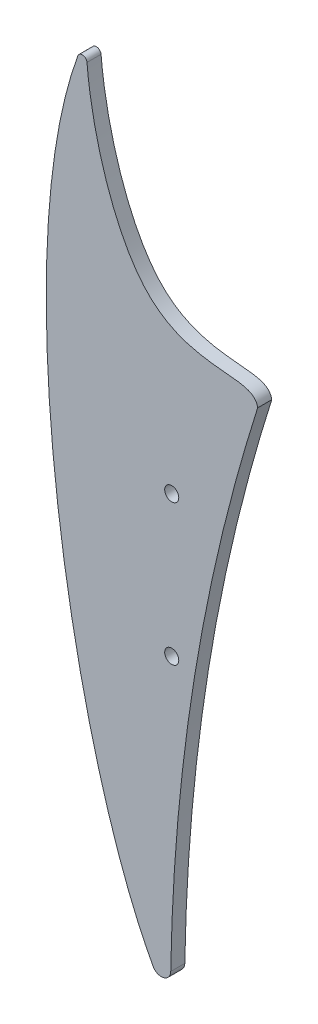
ISO-10303-21;
HEADER;
FILE_DESCRIPTION(('STEP AP214'),'2;1');
FILE_NAME('part.step','',(''),(''),'','','');
FILE_SCHEMA(('AUTOMOTIVE_DESIGN { 1 0 10303 214 1 1 1 1 }'));
ENDSEC;
DATA;
#1=APPLICATION_CONTEXT('core data for automotive mechanical design processes');
#2=APPLICATION_PROTOCOL_DEFINITION('international standard','automotive_design',2000,#1);
#3=PRODUCT_CONTEXT('',#1,'mechanical');
#4=PRODUCT('Part','Part','',(#3));
#5=PRODUCT_RELATED_PRODUCT_CATEGORY('part','',(#4));
#6=PRODUCT_DEFINITION_FORMATION('','',#4);
#7=PRODUCT_DEFINITION_CONTEXT('part definition',#1,'design');
#8=PRODUCT_DEFINITION('design','',#6,#7);
#9=PRODUCT_DEFINITION_SHAPE('','',#8);
#10=(LENGTH_UNIT() NAMED_UNIT(*) SI_UNIT(.MILLI.,.METRE.));
#11=(NAMED_UNIT(*) PLANE_ANGLE_UNIT() SI_UNIT($,.RADIAN.));
#12=(NAMED_UNIT(*) SI_UNIT($,.STERADIAN.) SOLID_ANGLE_UNIT());
#13=UNCERTAINTY_MEASURE_WITH_UNIT(LENGTH_MEASURE(1.E-05),#10,'distance_accuracy_value','');
#14=(GEOMETRIC_REPRESENTATION_CONTEXT(3) GLOBAL_UNCERTAINTY_ASSIGNED_CONTEXT((#13)) GLOBAL_UNIT_ASSIGNED_CONTEXT((#10,
#11,#12)) REPRESENTATION_CONTEXT('',''));
#15=CARTESIAN_POINT('',(0.,0.,0.));
#16=DIRECTION('',(0.,0.,1.));
#17=DIRECTION('',(1.,0.,0.));
#18=AXIS2_PLACEMENT_3D('',#15,#16,#17);
#19=CARTESIAN_POINT('',(-23.6689987829208,78.1957051543622,3.));
#20=DIRECTION('',(0.,0.,1.));
#21=DIRECTION('',(1.,0.,0.));
#22=AXIS2_PLACEMENT_3D('',#19,#20,#21);
#23=PLANE('',#22);
#24=CARTESIAN_POINT('',(0.270016121490892,95.,3.));
#25=DIRECTION('',(0.,0.,1.));
#26=DIRECTION('',(1.,0.,0.));
#27=AXIS2_PLACEMENT_3D('',#24,#25,#26);
#28=CIRCLE('',#27,1.5);
#29=CARTESIAN_POINT('',(1.77001612149089,95.,3.));
#30=VERTEX_POINT('',#29);
#31=EDGE_CURVE('E159',#30,#30,#28,.T.);
#32=ORIENTED_EDGE('',*,*,#31,.F.);
#33=EDGE_LOOP('',(#32));
#34=FACE_BOUND('',#33,.T.);
#35=CARTESIAN_POINT('',(-18.0327868852459,170.,3.));
#36=CARTESIAN_POINT('',(-37.6290565356995,125.986890487506,3.));
#37=CARTESIAN_POINT('',(-19.4773445903407,25.8683232574597,3.));
#38=CARTESIAN_POINT('',(0.,0.,3.));
#39=B_SPLINE_CURVE_WITH_KNOTS('',3,(#35,#36,#37,#38),.UNSPECIFIED.,.F.,.F.,(4,4),(0.,1.),.UNSPECIFIED.);
#40=CARTESIAN_POINT('',(-19.7241635399271,165.812740745156,3.));
#41=VERTEX_POINT('',#40);
#42=CARTESIAN_POINT('',(-3.69182068092924,5.80497360211119,3.));
#43=VERTEX_POINT('',#42);
#44=EDGE_CURVE('E102',#41,#43,#39,.T.);
#45=ORIENTED_EDGE('',*,*,#44,.T.);
#46=CARTESIAN_POINT('',(-1.93998225062961,6.76988920159403,3.));
#47=DIRECTION('',(0.,0.,1.));
#48=DIRECTION('',(1.,0.,0.));
#49=AXIS2_PLACEMENT_3D('',#46,#47,#48);
#50=CIRCLE('',#49,2.);
#51=CARTESIAN_POINT('',(0.0597245888532031,6.7356465947181,3.));
#52=VERTEX_POINT('',#51);
#53=EDGE_CURVE('E11',#43,#52,#50,.T.);
#54=ORIENTED_EDGE('',*,*,#53,.T.);
#55=CARTESIAN_POINT('',(0.,0.,3.));
#56=CARTESIAN_POINT('',(0.0390343335207113,61.6049294971021,3.));
#57=CARTESIAN_POINT('',(18.5792349726776,120.,3.));
#58=B_SPLINE_CURVE_WITH_KNOTS('',2,(#55,#56,#57),.UNSPECIFIED.,.F.,.F.,(3,3),(0.,1.),.UNSPECIFIED.);
#59=CARTESIAN_POINT('',(18.5792349726776,120.,3.));
#60=VERTEX_POINT('',#59);
#61=EDGE_CURVE('E91',#52,#60,#58,.T.);
#62=ORIENTED_EDGE('',*,*,#61,.T.);
#63=CARTESIAN_POINT('',(18.5792349726776,120.,3.));
#64=CARTESIAN_POINT('',(17.7206269119095,125.598656038931,3.));
#65=CARTESIAN_POINT('',(-6.53875171491765,115.023114241861,3.));
#66=CARTESIAN_POINT('',(-17.742349194384,156.285056374044,3.));
#67=CARTESIAN_POINT('',(-18.0327868852459,170.,3.));
#68=B_SPLINE_CURVE_WITH_KNOTS('',3,(#63,#64,#65,#66,#67),.UNSPECIFIED.,.F.,.F.,(4,1,4),(0.,
0.552596641346591,1.),.UNSPECIFIED.);
#69=CARTESIAN_POINT('',(-17.7888238584042,165.554985597369,3.));
#70=VERTEX_POINT('',#69);
#71=EDGE_CURVE('E95',#60,#70,#68,.T.);
#72=ORIENTED_EDGE('',*,*,#71,.T.);
#73=CARTESIAN_POINT('',(-18.7851161765829,165.468952948113,3.));
#74=DIRECTION('',(0.,0.,1.));
#75=DIRECTION('',(1.,0.,0.));
#76=AXIS2_PLACEMENT_3D('',#73,#74,#75);
#77=CIRCLE('',#76,1.);
#78=EDGE_CURVE('E194',#70,#41,#77,.T.);
#79=ORIENTED_EDGE('',*,*,#78,.T.);
#80=EDGE_LOOP('',(#45,#54,#62,#72,#79));
#81=FACE_BOUND('',#80,.T.);
#82=CARTESIAN_POINT('',(0.270016121490892,65.,3.));
#83=DIRECTION('',(0.,0.,1.));
#84=DIRECTION('',(1.,0.,0.));
#85=AXIS2_PLACEMENT_3D('',#82,#83,#84);
#86=CIRCLE('',#85,1.5);
#87=CARTESIAN_POINT('',(1.77001612149089,65.,3.));
#88=VERTEX_POINT('',#87);
#89=EDGE_CURVE('E160',#88,#88,#86,.T.);
#90=ORIENTED_EDGE('',*,*,#89,.F.);
#91=EDGE_LOOP('',(#90));
#92=FACE_BOUND('',#91,.T.);
#93=ADVANCED_FACE('F43',(#34,#81,#92),#23,.T.);
#94=CARTESIAN_POINT('',(-23.6689987829208,78.1957051543622,0.));
#95=DIRECTION('',(0.,0.,1.));
#96=DIRECTION('',(1.,0.,0.));
#97=AXIS2_PLACEMENT_3D('',#94,#95,#96);
#98=PLANE('',#97);
#99=CARTESIAN_POINT('',(0.,0.,0.));
#100=CARTESIAN_POINT('',(0.0390343335207113,61.6049294971021,0.));
#101=CARTESIAN_POINT('',(18.5792349726776,120.,0.));
#102=B_SPLINE_CURVE_WITH_KNOTS('',2,(#99,#100,#101),.UNSPECIFIED.,.F.,.F.,(3,3),(0.,1.),.UNSPECIFIED.);
#103=CARTESIAN_POINT('',(0.0597245888532031,6.7356465947181,0.));
#104=VERTEX_POINT('',#103);
#105=CARTESIAN_POINT('',(18.5792349726776,120.,0.));
#106=VERTEX_POINT('',#105);
#107=EDGE_CURVE('E107',#104,#106,#102,.T.);
#108=ORIENTED_EDGE('',*,*,#107,.F.);
#109=CARTESIAN_POINT('',(-1.93998225062961,6.76988920159403,0.));
#110=DIRECTION('',(0.,0.,1.));
#111=DIRECTION('',(1.,0.,0.));
#112=AXIS2_PLACEMENT_3D('',#109,#110,#111);
#113=CIRCLE('',#112,2.);
#114=CARTESIAN_POINT('',(-3.69182068092924,5.80497360211119,0.));
#115=VERTEX_POINT('',#114);
#116=EDGE_CURVE('E66',#104,#115,#113,.F.);
#117=ORIENTED_EDGE('',*,*,#116,.T.);
#118=CARTESIAN_POINT('',(-18.0327868852459,170.,0.));
#119=CARTESIAN_POINT('',(-37.6290565356995,125.986890487506,0.));
#120=CARTESIAN_POINT('',(-19.4773445903407,25.8683232574597,0.));
#121=CARTESIAN_POINT('',(0.,0.,0.));
#122=B_SPLINE_CURVE_WITH_KNOTS('',3,(#118,#119,#120,#121),.UNSPECIFIED.,.F.,.F.,(4,4),(0.,1.),.UNSPECIFIED.);
#123=CARTESIAN_POINT('',(-19.7241635399271,165.812740745156,0.));
#124=VERTEX_POINT('',#123);
#125=EDGE_CURVE('E127',#124,#115,#122,.T.);
#126=ORIENTED_EDGE('',*,*,#125,.F.);
#127=CARTESIAN_POINT('',(-18.7851161765829,165.468952948113,0.));
#128=DIRECTION('',(0.,0.,1.));
#129=DIRECTION('',(1.,0.,0.));
#130=AXIS2_PLACEMENT_3D('',#127,#128,#129);
#131=CIRCLE('',#130,1.);
#132=CARTESIAN_POINT('',(-17.7888238584042,165.554985597369,0.));
#133=VERTEX_POINT('',#132);
#134=EDGE_CURVE('E202',#124,#133,#131,.F.);
#135=ORIENTED_EDGE('',*,*,#134,.T.);
#136=CARTESIAN_POINT('',(18.5792349726776,120.,0.));
#137=CARTESIAN_POINT('',(17.7206269119095,125.598656038931,0.));
#138=CARTESIAN_POINT('',(-6.53875171491765,115.023114241861,0.));
#139=CARTESIAN_POINT('',(-17.742349194384,156.285056374044,0.));
#140=CARTESIAN_POINT('',(-18.0327868852459,170.,0.));
#141=B_SPLINE_CURVE_WITH_KNOTS('',3,(#136,#137,#138,#139,#140),.UNSPECIFIED.,.F.,.F.,(4,1,4),
(0.,0.552596641346591,1.),.UNSPECIFIED.);
#142=EDGE_CURVE('E151',#106,#133,#141,.T.);
#143=ORIENTED_EDGE('',*,*,#142,.F.);
#144=EDGE_LOOP('',(#108,#117,#126,#135,#143));
#145=FACE_BOUND('',#144,.T.);
#146=CARTESIAN_POINT('',(0.270016121490892,95.,0.));
#147=DIRECTION('',(0.,0.,1.));
#148=DIRECTION('',(1.,0.,0.));
#149=AXIS2_PLACEMENT_3D('',#146,#147,#148);
#150=CIRCLE('',#149,1.5);
#151=CARTESIAN_POINT('',(1.77001612149089,95.,0.));
#152=VERTEX_POINT('',#151);
#153=EDGE_CURVE('E152',#152,#152,#150,.T.);
#154=ORIENTED_EDGE('',*,*,#153,.T.);
#155=EDGE_LOOP('',(#154));
#156=FACE_BOUND('',#155,.T.);
#157=CARTESIAN_POINT('',(0.270016121490892,65.,0.));
#158=DIRECTION('',(0.,0.,1.));
#159=DIRECTION('',(1.,0.,0.));
#160=AXIS2_PLACEMENT_3D('',#157,#158,#159);
#161=CIRCLE('',#160,1.5);
#162=CARTESIAN_POINT('',(1.77001612149089,65.,0.));
#163=VERTEX_POINT('',#162);
#164=EDGE_CURVE('E164',#163,#163,#161,.T.);
#165=ORIENTED_EDGE('',*,*,#164,.T.);
#166=EDGE_LOOP('',(#165));
#167=FACE_BOUND('',#166,.T.);
#168=ADVANCED_FACE('F139',(#145,#156,#167),#98,.F.);
#169=DIRECTION('',(0.,0.,-1.));
#170=VECTOR('',#169,1.);
#171=SURFACE_OF_LINEAR_EXTRUSION('',#39,#170);
#172=ORIENTED_EDGE('',*,*,#125,.T.);
#173=DIRECTION('',(0.,0.,-1.));
#174=VECTOR('',#173,1.);
#175=CARTESIAN_POINT('',(-3.6918206809292,5.80497360211112,0.));
#176=LINE('',#175,#174);
#177=EDGE_CURVE('E52',#115,#43,#176,.F.);
#178=ORIENTED_EDGE('',*,*,#177,.T.);
#179=ORIENTED_EDGE('',*,*,#44,.F.);
#180=DIRECTION('',(0.,0.,-1.));
#181=VECTOR('',#180,1.);
#182=CARTESIAN_POINT('',(-19.7241635399271,165.812740745156,3.));
#183=LINE('',#182,#181);
#184=EDGE_CURVE('E112',#41,#124,#183,.T.);
#185=ORIENTED_EDGE('',*,*,#184,.T.);
#186=EDGE_LOOP('',(#172,#178,#179,#185));
#187=FACE_BOUND('',#186,.T.);
#188=ADVANCED_FACE('F143',(#187),#171,.F.);
#189=DIRECTION('',(0.,0.,-1.));
#190=VECTOR('',#189,1.);
#191=SURFACE_OF_LINEAR_EXTRUSION('',#58,#190);
#192=ORIENTED_EDGE('',*,*,#61,.F.);
#193=DIRECTION('',(0.,0.,-1.));
#194=VECTOR('',#193,1.);
#195=CARTESIAN_POINT('',(0.0597245888532031,6.7356465947181,3.));
#196=LINE('',#195,#194);
#197=EDGE_CURVE('E197',#52,#104,#196,.T.);
#198=ORIENTED_EDGE('',*,*,#197,.T.);
#199=ORIENTED_EDGE('',*,*,#107,.T.);
#200=DIRECTION('',(0.,0.,-1.));
#201=VECTOR('',#200,1.);
#202=CARTESIAN_POINT('',(18.5792349726776,120.,3.));
#203=LINE('',#202,#201);
#204=EDGE_CURVE('E105',#60,#106,#203,.T.);
#205=ORIENTED_EDGE('',*,*,#204,.F.);
#206=EDGE_LOOP('',(#192,#198,#199,#205));
#207=FACE_BOUND('',#206,.T.);
#208=ADVANCED_FACE('F106',(#207),#191,.F.);
#209=DIRECTION('',(0.,0.,-1.));
#210=VECTOR('',#209,1.);
#211=SURFACE_OF_LINEAR_EXTRUSION('',#68,#210);
#212=ORIENTED_EDGE('',*,*,#142,.T.);
#213=DIRECTION('',(0.,0.,-1.));
#214=VECTOR('',#213,1.);
#215=CARTESIAN_POINT('',(-17.7888238584042,165.554985597369,0.));
#216=LINE('',#215,#214);
#217=EDGE_CURVE('E116',#133,#70,#216,.F.);
#218=ORIENTED_EDGE('',*,*,#217,.T.);
#219=ORIENTED_EDGE('',*,*,#71,.F.);
#220=ORIENTED_EDGE('',*,*,#204,.T.);
#221=EDGE_LOOP('',(#212,#218,#219,#220));
#222=FACE_BOUND('',#221,.T.);
#223=ADVANCED_FACE('F114',(#222),#211,.F.);
#224=CARTESIAN_POINT('',(0.270016121490892,95.,3.));
#225=DIRECTION('',(0.,0.,-1.));
#226=DIRECTION('',(-1.,0.,0.));
#227=AXIS2_PLACEMENT_3D('',#224,#225,#226);
#228=CYLINDRICAL_SURFACE('',#227,1.5);
#229=ORIENTED_EDGE('',*,*,#31,.T.);
#230=EDGE_LOOP('',(#229));
#231=FACE_BOUND('',#230,.T.);
#232=ORIENTED_EDGE('',*,*,#153,.F.);
#233=EDGE_LOOP('',(#232));
#234=FACE_BOUND('',#233,.T.);
#235=ADVANCED_FACE('F138',(#231,#234),#228,.F.);
#236=CARTESIAN_POINT('',(0.270016121490892,65.,3.));
#237=DIRECTION('',(0.,0.,-1.));
#238=DIRECTION('',(-1.,0.,0.));
#239=AXIS2_PLACEMENT_3D('',#236,#237,#238);
#240=CYLINDRICAL_SURFACE('',#239,1.5);
#241=ORIENTED_EDGE('',*,*,#89,.T.);
#242=EDGE_LOOP('',(#241));
#243=FACE_BOUND('',#242,.T.);
#244=ORIENTED_EDGE('',*,*,#164,.F.);
#245=EDGE_LOOP('',(#244));
#246=FACE_BOUND('',#245,.T.);
#247=ADVANCED_FACE('F172',(#243,#246),#240,.F.);
#248=CARTESIAN_POINT('',(-18.7851161765829,165.468952948113,1.5));
#249=DIRECTION('',(0.,0.,-1.));
#250=DIRECTION('',(-1.,0.,0.));
#251=AXIS2_PLACEMENT_3D('',#248,#249,#250);
#252=CYLINDRICAL_SURFACE('',#251,1.);
#253=ORIENTED_EDGE('',*,*,#78,.F.);
#254=ORIENTED_EDGE('',*,*,#217,.F.);
#255=ORIENTED_EDGE('',*,*,#134,.F.);
#256=ORIENTED_EDGE('',*,*,#184,.F.);
#257=EDGE_LOOP('',(#253,#254,#255,#256));
#258=FACE_BOUND('',#257,.T.);
#259=ADVANCED_FACE('F145',(#258),#252,.T.);
#260=CARTESIAN_POINT('',(-1.93998225062961,6.76988920159403,1.5));
#261=DIRECTION('',(0.,0.,-1.));
#262=DIRECTION('',(-1.,0.,0.));
#263=AXIS2_PLACEMENT_3D('',#260,#261,#262);
#264=CYLINDRICAL_SURFACE('',#263,2.);
#265=ORIENTED_EDGE('',*,*,#53,.F.);
#266=ORIENTED_EDGE('',*,*,#177,.F.);
#267=ORIENTED_EDGE('',*,*,#116,.F.);
#268=ORIENTED_EDGE('',*,*,#197,.F.);
#269=EDGE_LOOP('',(#265,#266,#267,#268));
#270=FACE_BOUND('',#269,.T.);
#271=ADVANCED_FACE('F45',(#270),#264,.T.);
#272=CLOSED_SHELL('',(#93,#168,#188,#208,#223,#235,#247,#259,#271));
#273=MANIFOLD_SOLID_BREP('B2',#272);
#274=ADVANCED_BREP_SHAPE_REPRESENTATION('',(#18,#273),#14);
#275=SHAPE_DEFINITION_REPRESENTATION(#9,#274);
ENDSEC;
END-ISO-10303-21;
